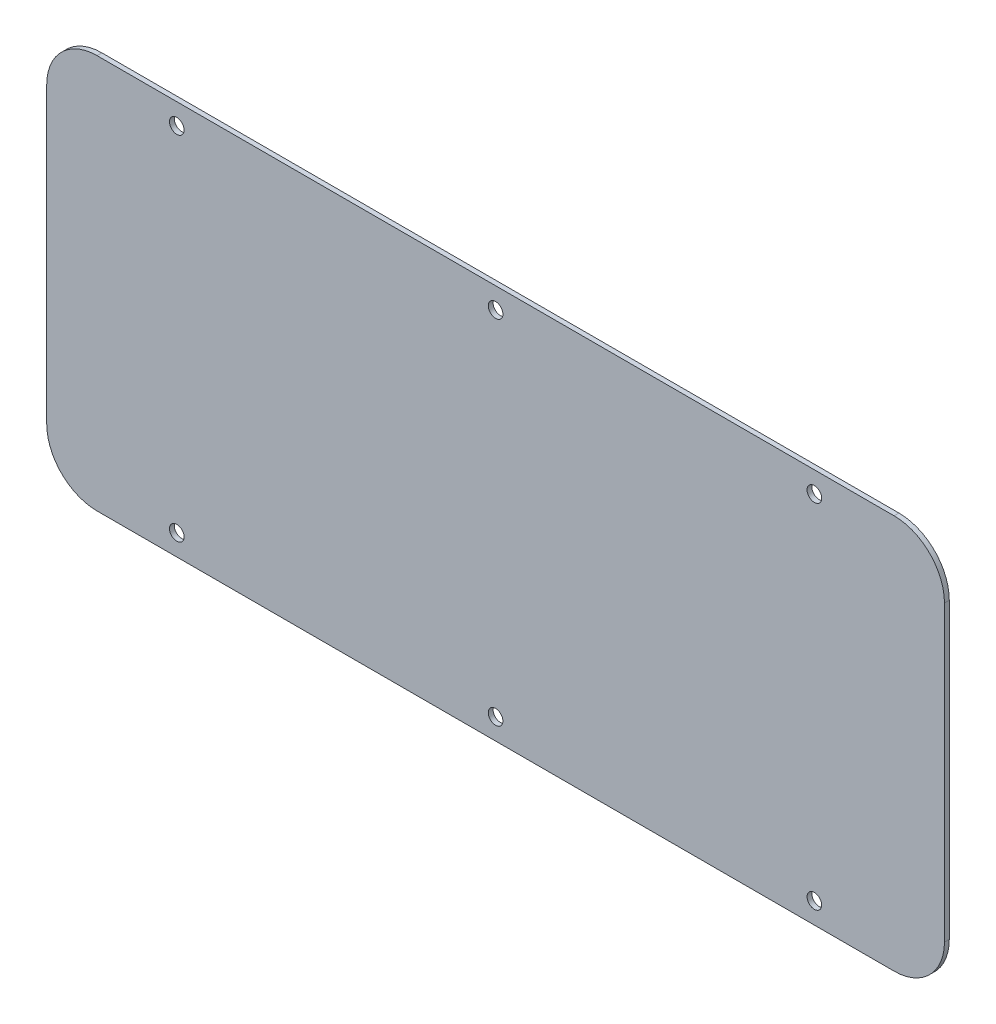
ISO-10303-21;
HEADER;
FILE_DESCRIPTION(('STEP AP214'),'2;1');
FILE_NAME('part.step','',(''),(''),'','','');
FILE_SCHEMA(('AUTOMOTIVE_DESIGN { 1 0 10303 214 1 1 1 1 }'));
ENDSEC;
DATA;
#1=APPLICATION_CONTEXT('core data for automotive mechanical design processes');
#2=APPLICATION_PROTOCOL_DEFINITION('international standard','automotive_design',2000,#1);
#3=PRODUCT_CONTEXT('',#1,'mechanical');
#4=PRODUCT('Part','Part','',(#3));
#5=PRODUCT_RELATED_PRODUCT_CATEGORY('part','',(#4));
#6=PRODUCT_DEFINITION_FORMATION('','',#4);
#7=PRODUCT_DEFINITION_CONTEXT('part definition',#1,'design');
#8=PRODUCT_DEFINITION('design','',#6,#7);
#9=PRODUCT_DEFINITION_SHAPE('','',#8);
#10=(LENGTH_UNIT() NAMED_UNIT(*) SI_UNIT(.MILLI.,.METRE.));
#11=(NAMED_UNIT(*) PLANE_ANGLE_UNIT() SI_UNIT($,.RADIAN.));
#12=(NAMED_UNIT(*) SI_UNIT($,.STERADIAN.) SOLID_ANGLE_UNIT());
#13=UNCERTAINTY_MEASURE_WITH_UNIT(LENGTH_MEASURE(1.E-05),#10,'distance_accuracy_value','');
#14=(GEOMETRIC_REPRESENTATION_CONTEXT(3) GLOBAL_UNCERTAINTY_ASSIGNED_CONTEXT((#13)) GLOBAL_UNIT_ASSIGNED_CONTEXT((#10,
#11,#12)) REPRESENTATION_CONTEXT('',''));
#15=CARTESIAN_POINT('',(0.,0.,0.));
#16=DIRECTION('',(0.,0.,1.));
#17=DIRECTION('',(1.,0.,0.));
#18=AXIS2_PLACEMENT_3D('',#15,#16,#17);
#19=CARTESIAN_POINT('',(-169.8625,-74.6125,0.));
#20=DIRECTION('',(0.,0.,1.));
#21=DIRECTION('',(1.,0.,0.));
#22=AXIS2_PLACEMENT_3D('',#19,#20,#21);
#23=PLANE('',#22);
#24=DIRECTION('',(1.,0.,0.));
#25=VECTOR('',#24,1.);
#26=CARTESIAN_POINT('',(169.8625,74.6125,0.));
#27=LINE('',#26,#25);
#28=CARTESIAN_POINT('',(-150.8125,74.6125,0.));
#29=VERTEX_POINT('',#28);
#30=CARTESIAN_POINT('',(150.8125,74.6125,0.));
#31=VERTEX_POINT('',#30);
#32=EDGE_CURVE('E115',#29,#31,#27,.T.);
#33=ORIENTED_EDGE('',*,*,#32,.F.);
#34=CARTESIAN_POINT('',(-150.8125,55.5625,0.));
#35=DIRECTION('',(0.,0.,-1.));
#36=DIRECTION('',(-1.,0.,0.));
#37=AXIS2_PLACEMENT_3D('',#34,#35,#36);
#38=CIRCLE('',#37,19.05);
#39=CARTESIAN_POINT('',(-169.8625,55.5625,0.));
#40=VERTEX_POINT('',#39);
#41=EDGE_CURVE('E151',#40,#29,#38,.T.);
#42=ORIENTED_EDGE('',*,*,#41,.F.);
#43=DIRECTION('',(0.,1.,0.));
#44=VECTOR('',#43,1.);
#45=CARTESIAN_POINT('',(-169.8625,74.6125,0.));
#46=LINE('',#45,#44);
#47=CARTESIAN_POINT('',(-169.8625,-55.5625,0.));
#48=VERTEX_POINT('',#47);
#49=EDGE_CURVE('E111',#48,#40,#46,.T.);
#50=ORIENTED_EDGE('',*,*,#49,.F.);
#51=CARTESIAN_POINT('',(-150.8125,-55.5625,0.));
#52=DIRECTION('',(0.,0.,-1.));
#53=DIRECTION('',(-1.,0.,0.));
#54=AXIS2_PLACEMENT_3D('',#51,#52,#53);
#55=CIRCLE('',#54,19.05);
#56=CARTESIAN_POINT('',(-150.8125,-74.6125,0.));
#57=VERTEX_POINT('',#56);
#58=EDGE_CURVE('E149',#57,#48,#55,.T.);
#59=ORIENTED_EDGE('',*,*,#58,.F.);
#60=DIRECTION('',(1.,0.,0.));
#61=VECTOR('',#60,1.);
#62=CARTESIAN_POINT('',(-169.8625,-74.6125,0.));
#63=LINE('',#62,#61);
#64=CARTESIAN_POINT('',(150.8125,-74.6125,0.));
#65=VERTEX_POINT('',#64);
#66=EDGE_CURVE('E94',#65,#57,#63,.F.);
#67=ORIENTED_EDGE('',*,*,#66,.F.);
#68=CARTESIAN_POINT('',(150.8125,-55.5625,0.));
#69=DIRECTION('',(0.,0.,-1.));
#70=DIRECTION('',(-1.,0.,0.));
#71=AXIS2_PLACEMENT_3D('',#68,#69,#70);
#72=CIRCLE('',#71,19.05);
#73=CARTESIAN_POINT('',(169.8625,-55.5625,0.));
#74=VERTEX_POINT('',#73);
#75=EDGE_CURVE('E87',#74,#65,#72,.T.);
#76=ORIENTED_EDGE('',*,*,#75,.F.);
#77=DIRECTION('',(0.,1.,0.));
#78=VECTOR('',#77,1.);
#79=CARTESIAN_POINT('',(169.8625,-74.6125,0.));
#80=LINE('',#79,#78);
#81=CARTESIAN_POINT('',(169.8625,55.5625,0.));
#82=VERTEX_POINT('',#81);
#83=EDGE_CURVE('E77',#82,#74,#80,.F.);
#84=ORIENTED_EDGE('',*,*,#83,.F.);
#85=CARTESIAN_POINT('',(150.8125,55.5625,0.));
#86=DIRECTION('',(0.,0.,-1.));
#87=DIRECTION('',(-1.,0.,0.));
#88=AXIS2_PLACEMENT_3D('',#85,#86,#87);
#89=CIRCLE('',#88,19.05);
#90=EDGE_CURVE('E103',#31,#82,#89,.T.);
#91=ORIENTED_EDGE('',*,*,#90,.F.);
#92=EDGE_LOOP('',(#33,#42,#50,#59,#67,#76,#84,#91));
#93=FACE_BOUND('',#92,.T.);
#94=CARTESIAN_POINT('',(-120.6373,-66.675,0.));
#95=DIRECTION('',(0.,0.,-1.));
#96=DIRECTION('',(-1.,0.,0.));
#97=AXIS2_PLACEMENT_3D('',#94,#95,#96);
#98=CIRCLE('',#97,2.7686);
#99=CARTESIAN_POINT('',(-123.4059,-66.675,0.));
#100=VERTEX_POINT('',#99);
#101=EDGE_CURVE('E98',#100,#100,#98,.T.);
#102=ORIENTED_EDGE('',*,*,#101,.T.);
#103=EDGE_LOOP('',(#102));
#104=FACE_BOUND('',#103,.T.);
#105=CARTESIAN_POINT('',(0.,-66.675,0.));
#106=DIRECTION('',(0.,0.,-1.));
#107=DIRECTION('',(-1.,0.,0.));
#108=AXIS2_PLACEMENT_3D('',#105,#106,#107);
#109=CIRCLE('',#108,2.7686);
#110=CARTESIAN_POINT('',(-2.76860000000004,-66.675,0.));
#111=VERTEX_POINT('',#110);
#112=EDGE_CURVE('E155',#111,#111,#109,.T.);
#113=ORIENTED_EDGE('',*,*,#112,.T.);
#114=EDGE_LOOP('',(#113));
#115=FACE_BOUND('',#114,.T.);
#116=CARTESIAN_POINT('',(120.6373,-66.675,0.));
#117=DIRECTION('',(0.,0.,-1.));
#118=DIRECTION('',(-1.,0.,0.));
#119=AXIS2_PLACEMENT_3D('',#116,#117,#118);
#120=CIRCLE('',#119,2.7686);
#121=CARTESIAN_POINT('',(117.8687,-66.675,0.));
#122=VERTEX_POINT('',#121);
#123=EDGE_CURVE('E158',#122,#122,#120,.T.);
#124=ORIENTED_EDGE('',*,*,#123,.T.);
#125=EDGE_LOOP('',(#124));
#126=FACE_BOUND('',#125,.T.);
#127=CARTESIAN_POINT('',(-120.6373,66.675,0.));
#128=DIRECTION('',(0.,0.,-1.));
#129=DIRECTION('',(-1.,0.,0.));
#130=AXIS2_PLACEMENT_3D('',#127,#128,#129);
#131=CIRCLE('',#130,2.7686);
#132=CARTESIAN_POINT('',(-123.4059,66.675,0.));
#133=VERTEX_POINT('',#132);
#134=EDGE_CURVE('E161',#133,#133,#131,.T.);
#135=ORIENTED_EDGE('',*,*,#134,.T.);
#136=EDGE_LOOP('',(#135));
#137=FACE_BOUND('',#136,.T.);
#138=CARTESIAN_POINT('',(0.,66.675,0.));
#139=DIRECTION('',(0.,0.,-1.));
#140=DIRECTION('',(-1.,0.,0.));
#141=AXIS2_PLACEMENT_3D('',#138,#139,#140);
#142=CIRCLE('',#141,2.7686);
#143=CARTESIAN_POINT('',(-2.76860000000004,66.675,0.));
#144=VERTEX_POINT('',#143);
#145=EDGE_CURVE('E163',#144,#144,#142,.T.);
#146=ORIENTED_EDGE('',*,*,#145,.T.);
#147=EDGE_LOOP('',(#146));
#148=FACE_BOUND('',#147,.T.);
#149=CARTESIAN_POINT('',(120.6373,66.675,0.));
#150=DIRECTION('',(0.,0.,-1.));
#151=DIRECTION('',(-1.,0.,0.));
#152=AXIS2_PLACEMENT_3D('',#149,#150,#151);
#153=CIRCLE('',#152,2.7686);
#154=CARTESIAN_POINT('',(117.8687,66.675,0.));
#155=VERTEX_POINT('',#154);
#156=EDGE_CURVE('E19',#155,#155,#153,.T.);
#157=ORIENTED_EDGE('',*,*,#156,.T.);
#158=EDGE_LOOP('',(#157));
#159=FACE_BOUND('',#158,.T.);
#160=ADVANCED_FACE('F16',(#93,#104,#115,#126,#137,#148,#159),#23,.T.);
#161=CARTESIAN_POINT('',(120.6373,66.675,-371.058648678938));
#162=DIRECTION('',(0.,0.,-1.));
#163=DIRECTION('',(-1.,0.,0.));
#164=AXIS2_PLACEMENT_3D('',#161,#162,#163);
#165=CYLINDRICAL_SURFACE('',#164,2.7686);
#166=ORIENTED_EDGE('',*,*,#156,.F.);
#167=EDGE_LOOP('',(#166));
#168=FACE_BOUND('',#167,.T.);
#169=CARTESIAN_POINT('',(120.6373,66.675,-1.82880000000002));
#170=DIRECTION('',(0.,0.,-1.));
#171=DIRECTION('',(-1.,0.,0.));
#172=AXIS2_PLACEMENT_3D('',#169,#170,#171);
#173=CIRCLE('',#172,2.7686);
#174=CARTESIAN_POINT('',(117.8687,66.675,-1.82880000000002));
#175=VERTEX_POINT('',#174);
#176=EDGE_CURVE('E145',#175,#175,#173,.T.);
#177=ORIENTED_EDGE('',*,*,#176,.T.);
#178=EDGE_LOOP('',(#177));
#179=FACE_BOUND('',#178,.T.);
#180=ADVANCED_FACE('F171',(#168,#179),#165,.F.);
#181=CARTESIAN_POINT('',(0.,66.675,-371.058648678938));
#182=DIRECTION('',(0.,0.,-1.));
#183=DIRECTION('',(-1.,0.,0.));
#184=AXIS2_PLACEMENT_3D('',#181,#182,#183);
#185=CYLINDRICAL_SURFACE('',#184,2.7686);
#186=ORIENTED_EDGE('',*,*,#145,.F.);
#187=EDGE_LOOP('',(#186));
#188=FACE_BOUND('',#187,.T.);
#189=CARTESIAN_POINT('',(0.,66.675,-1.82880000000002));
#190=DIRECTION('',(0.,0.,-1.));
#191=DIRECTION('',(-1.,0.,0.));
#192=AXIS2_PLACEMENT_3D('',#189,#190,#191);
#193=CIRCLE('',#192,2.7686);
#194=CARTESIAN_POINT('',(-2.76860000000004,66.675,-1.82880000000002));
#195=VERTEX_POINT('',#194);
#196=EDGE_CURVE('E142',#195,#195,#193,.T.);
#197=ORIENTED_EDGE('',*,*,#196,.T.);
#198=EDGE_LOOP('',(#197));
#199=FACE_BOUND('',#198,.T.);
#200=ADVANCED_FACE('F174',(#188,#199),#185,.F.);
#201=CARTESIAN_POINT('',(-120.6373,66.675,-371.058648678938));
#202=DIRECTION('',(0.,0.,-1.));
#203=DIRECTION('',(-1.,0.,0.));
#204=AXIS2_PLACEMENT_3D('',#201,#202,#203);
#205=CYLINDRICAL_SURFACE('',#204,2.7686);
#206=ORIENTED_EDGE('',*,*,#134,.F.);
#207=EDGE_LOOP('',(#206));
#208=FACE_BOUND('',#207,.T.);
#209=CARTESIAN_POINT('',(-120.6373,66.675,-1.82880000000002));
#210=DIRECTION('',(0.,0.,-1.));
#211=DIRECTION('',(-1.,0.,0.));
#212=AXIS2_PLACEMENT_3D('',#209,#210,#211);
#213=CIRCLE('',#212,2.7686);
#214=CARTESIAN_POINT('',(-123.4059,66.675,-1.82880000000002));
#215=VERTEX_POINT('',#214);
#216=EDGE_CURVE('E139',#215,#215,#213,.T.);
#217=ORIENTED_EDGE('',*,*,#216,.T.);
#218=EDGE_LOOP('',(#217));
#219=FACE_BOUND('',#218,.T.);
#220=ADVANCED_FACE('F225',(#208,#219),#205,.F.);
#221=CARTESIAN_POINT('',(120.6373,-66.675,-371.058648678938));
#222=DIRECTION('',(0.,0.,-1.));
#223=DIRECTION('',(-1.,0.,0.));
#224=AXIS2_PLACEMENT_3D('',#221,#222,#223);
#225=CYLINDRICAL_SURFACE('',#224,2.7686);
#226=ORIENTED_EDGE('',*,*,#123,.F.);
#227=EDGE_LOOP('',(#226));
#228=FACE_BOUND('',#227,.T.);
#229=CARTESIAN_POINT('',(120.6373,-66.675,-1.82880000000002));
#230=DIRECTION('',(0.,0.,-1.));
#231=DIRECTION('',(-1.,0.,0.));
#232=AXIS2_PLACEMENT_3D('',#229,#230,#231);
#233=CIRCLE('',#232,2.7686);
#234=CARTESIAN_POINT('',(117.8687,-66.675,-1.82880000000002));
#235=VERTEX_POINT('',#234);
#236=EDGE_CURVE('E136',#235,#235,#233,.T.);
#237=ORIENTED_EDGE('',*,*,#236,.T.);
#238=EDGE_LOOP('',(#237));
#239=FACE_BOUND('',#238,.T.);
#240=ADVANCED_FACE('F221',(#228,#239),#225,.F.);
#241=CARTESIAN_POINT('',(0.,-66.675,-371.058648678938));
#242=DIRECTION('',(0.,0.,-1.));
#243=DIRECTION('',(-1.,0.,0.));
#244=AXIS2_PLACEMENT_3D('',#241,#242,#243);
#245=CYLINDRICAL_SURFACE('',#244,2.7686);
#246=ORIENTED_EDGE('',*,*,#112,.F.);
#247=EDGE_LOOP('',(#246));
#248=FACE_BOUND('',#247,.T.);
#249=CARTESIAN_POINT('',(0.,-66.675,-1.82880000000002));
#250=DIRECTION('',(0.,0.,-1.));
#251=DIRECTION('',(-1.,0.,0.));
#252=AXIS2_PLACEMENT_3D('',#249,#250,#251);
#253=CIRCLE('',#252,2.7686);
#254=CARTESIAN_POINT('',(-2.76860000000004,-66.675,-1.82880000000002));
#255=VERTEX_POINT('',#254);
#256=EDGE_CURVE('E133',#255,#255,#253,.T.);
#257=ORIENTED_EDGE('',*,*,#256,.T.);
#258=EDGE_LOOP('',(#257));
#259=FACE_BOUND('',#258,.T.);
#260=ADVANCED_FACE('F217',(#248,#259),#245,.F.);
#261=CARTESIAN_POINT('',(-120.6373,-66.675,-371.058648678938));
#262=DIRECTION('',(0.,0.,-1.));
#263=DIRECTION('',(-1.,0.,0.));
#264=AXIS2_PLACEMENT_3D('',#261,#262,#263);
#265=CYLINDRICAL_SURFACE('',#264,2.7686);
#266=ORIENTED_EDGE('',*,*,#101,.F.);
#267=EDGE_LOOP('',(#266));
#268=FACE_BOUND('',#267,.T.);
#269=CARTESIAN_POINT('',(-120.6373,-66.675,-1.82880000000002));
#270=DIRECTION('',(0.,0.,-1.));
#271=DIRECTION('',(-1.,0.,0.));
#272=AXIS2_PLACEMENT_3D('',#269,#270,#271);
#273=CIRCLE('',#272,2.7686);
#274=CARTESIAN_POINT('',(-123.4059,-66.675,-1.82880000000002));
#275=VERTEX_POINT('',#274);
#276=EDGE_CURVE('E130',#275,#275,#273,.T.);
#277=ORIENTED_EDGE('',*,*,#276,.T.);
#278=EDGE_LOOP('',(#277));
#279=FACE_BOUND('',#278,.T.);
#280=ADVANCED_FACE('F214',(#268,#279),#265,.F.);
#281=CARTESIAN_POINT('',(150.8125,-55.5625,-1.8288));
#282=DIRECTION('',(0.,0.,-1.));
#283=DIRECTION('',(-1.,0.,0.));
#284=AXIS2_PLACEMENT_3D('',#281,#282,#283);
#285=CYLINDRICAL_SURFACE('',#284,19.05);
#286=ORIENTED_EDGE('',*,*,#75,.T.);
#287=DIRECTION('',(0.,0.,-1.));
#288=VECTOR('',#287,1.);
#289=CARTESIAN_POINT('',(150.8125,-74.6125,-1.8288));
#290=LINE('',#289,#288);
#291=CARTESIAN_POINT('',(150.8125,-74.6125,-1.8288));
#292=VERTEX_POINT('',#291);
#293=EDGE_CURVE('E148',#292,#65,#290,.F.);
#294=ORIENTED_EDGE('',*,*,#293,.F.);
#295=CARTESIAN_POINT('',(150.8125,-55.5625,-1.8288));
#296=DIRECTION('',(0.,0.,-1.));
#297=DIRECTION('',(-1.,0.,0.));
#298=AXIS2_PLACEMENT_3D('',#295,#296,#297);
#299=CIRCLE('',#298,19.05);
#300=CARTESIAN_POINT('',(169.8625,-55.5625,-1.8288));
#301=VERTEX_POINT('',#300);
#302=EDGE_CURVE('E102',#292,#301,#299,.F.);
#303=ORIENTED_EDGE('',*,*,#302,.T.);
#304=DIRECTION('',(0.,0.,1.));
#305=VECTOR('',#304,1.);
#306=CARTESIAN_POINT('',(169.8625,-55.5625,-1.8288));
#307=LINE('',#306,#305);
#308=EDGE_CURVE('E82',#74,#301,#307,.F.);
#309=ORIENTED_EDGE('',*,*,#308,.F.);
#310=EDGE_LOOP('',(#286,#294,#303,#309));
#311=FACE_BOUND('',#310,.T.);
#312=ADVANCED_FACE('F101',(#311),#285,.T.);
#313=CARTESIAN_POINT('',(169.8625,-74.6125,-1.8288));
#314=DIRECTION('',(1.,0.,0.));
#315=DIRECTION('',(0.,1.,0.));
#316=AXIS2_PLACEMENT_3D('',#313,#314,#315);
#317=PLANE('',#316);
#318=ORIENTED_EDGE('',*,*,#83,.T.);
#319=ORIENTED_EDGE('',*,*,#308,.T.);
#320=DIRECTION('',(0.,1.,0.));
#321=VECTOR('',#320,1.);
#322=CARTESIAN_POINT('',(169.8625,-74.6125,-1.8288));
#323=LINE('',#322,#321);
#324=CARTESIAN_POINT('',(169.8625,55.5625,-1.8288));
#325=VERTEX_POINT('',#324);
#326=EDGE_CURVE('E128',#301,#325,#323,.T.);
#327=ORIENTED_EDGE('',*,*,#326,.T.);
#328=DIRECTION('',(0.,0.,-1.));
#329=VECTOR('',#328,1.);
#330=CARTESIAN_POINT('',(169.8625,55.5625,-1.8288));
#331=LINE('',#330,#329);
#332=EDGE_CURVE('E84',#82,#325,#331,.T.);
#333=ORIENTED_EDGE('',*,*,#332,.F.);
#334=EDGE_LOOP('',(#318,#319,#327,#333));
#335=FACE_BOUND('',#334,.T.);
#336=ADVANCED_FACE('F79',(#335),#317,.T.);
#337=CARTESIAN_POINT('',(150.8125,55.5625,-1.8288));
#338=DIRECTION('',(0.,0.,-1.));
#339=DIRECTION('',(-1.,0.,0.));
#340=AXIS2_PLACEMENT_3D('',#337,#338,#339);
#341=CYLINDRICAL_SURFACE('',#340,19.05);
#342=ORIENTED_EDGE('',*,*,#90,.T.);
#343=ORIENTED_EDGE('',*,*,#332,.T.);
#344=CARTESIAN_POINT('',(150.8125,55.5625,-1.8288));
#345=DIRECTION('',(0.,0.,-1.));
#346=DIRECTION('',(-1.,0.,0.));
#347=AXIS2_PLACEMENT_3D('',#344,#345,#346);
#348=CIRCLE('',#347,19.05);
#349=CARTESIAN_POINT('',(150.8125,74.6125,-1.8288));
#350=VERTEX_POINT('',#349);
#351=EDGE_CURVE('E125',#325,#350,#348,.F.);
#352=ORIENTED_EDGE('',*,*,#351,.T.);
#353=DIRECTION('',(0.,0.,1.));
#354=VECTOR('',#353,1.);
#355=CARTESIAN_POINT('',(150.8125,74.6125,-1.8288));
#356=LINE('',#355,#354);
#357=EDGE_CURVE('E116',#31,#350,#356,.F.);
#358=ORIENTED_EDGE('',*,*,#357,.F.);
#359=EDGE_LOOP('',(#342,#343,#352,#358));
#360=FACE_BOUND('',#359,.T.);
#361=ADVANCED_FACE('F205',(#360),#341,.T.);
#362=CARTESIAN_POINT('',(169.8625,74.6125,-1.8288));
#363=DIRECTION('',(0.,1.,0.));
#364=DIRECTION('',(0.,0.,1.));
#365=AXIS2_PLACEMENT_3D('',#362,#363,#364);
#366=PLANE('',#365);
#367=ORIENTED_EDGE('',*,*,#32,.T.);
#368=ORIENTED_EDGE('',*,*,#357,.T.);
#369=DIRECTION('',(1.,0.,0.));
#370=VECTOR('',#369,1.);
#371=CARTESIAN_POINT('',(-169.8625,74.6125,-1.8288));
#372=LINE('',#371,#370);
#373=CARTESIAN_POINT('',(-150.8125,74.6125,-1.8288));
#374=VERTEX_POINT('',#373);
#375=EDGE_CURVE('E124',#350,#374,#372,.F.);
#376=ORIENTED_EDGE('',*,*,#375,.T.);
#377=DIRECTION('',(0.,0.,-1.));
#378=VECTOR('',#377,1.);
#379=CARTESIAN_POINT('',(-150.8125,74.6125,-1.8288));
#380=LINE('',#379,#378);
#381=EDGE_CURVE('E114',#29,#374,#380,.T.);
#382=ORIENTED_EDGE('',*,*,#381,.F.);
#383=EDGE_LOOP('',(#367,#368,#376,#382));
#384=FACE_BOUND('',#383,.T.);
#385=ADVANCED_FACE('F201',(#384),#366,.T.);
#386=CARTESIAN_POINT('',(-150.8125,55.5625,-1.8288));
#387=DIRECTION('',(0.,0.,-1.));
#388=DIRECTION('',(-1.,0.,0.));
#389=AXIS2_PLACEMENT_3D('',#386,#387,#388);
#390=CYLINDRICAL_SURFACE('',#389,19.05);
#391=ORIENTED_EDGE('',*,*,#41,.T.);
#392=ORIENTED_EDGE('',*,*,#381,.T.);
#393=CARTESIAN_POINT('',(-150.8125,55.5625,-1.8288));
#394=DIRECTION('',(0.,0.,-1.));
#395=DIRECTION('',(-1.,0.,0.));
#396=AXIS2_PLACEMENT_3D('',#393,#394,#395);
#397=CIRCLE('',#396,19.05);
#398=CARTESIAN_POINT('',(-169.8625,55.5625,-1.8288));
#399=VERTEX_POINT('',#398);
#400=EDGE_CURVE('E121',#374,#399,#397,.F.);
#401=ORIENTED_EDGE('',*,*,#400,.T.);
#402=DIRECTION('',(0.,0.,1.));
#403=VECTOR('',#402,1.);
#404=CARTESIAN_POINT('',(-169.8625,55.5625,-1.8288));
#405=LINE('',#404,#403);
#406=EDGE_CURVE('E113',#40,#399,#405,.F.);
#407=ORIENTED_EDGE('',*,*,#406,.F.);
#408=EDGE_LOOP('',(#391,#392,#401,#407));
#409=FACE_BOUND('',#408,.T.);
#410=ADVANCED_FACE('F197',(#409),#390,.T.);
#411=CARTESIAN_POINT('',(-169.8625,74.6125,-1.8288));
#412=DIRECTION('',(-1.,0.,0.));
#413=DIRECTION('',(0.,0.,1.));
#414=AXIS2_PLACEMENT_3D('',#411,#412,#413);
#415=PLANE('',#414);
#416=ORIENTED_EDGE('',*,*,#49,.T.);
#417=ORIENTED_EDGE('',*,*,#406,.T.);
#418=DIRECTION('',(0.,1.,0.));
#419=VECTOR('',#418,1.);
#420=CARTESIAN_POINT('',(-169.8625,-74.6125,-1.8288));
#421=LINE('',#420,#419);
#422=CARTESIAN_POINT('',(-169.8625,-55.5625,-1.8288));
#423=VERTEX_POINT('',#422);
#424=EDGE_CURVE('E120',#399,#423,#421,.F.);
#425=ORIENTED_EDGE('',*,*,#424,.T.);
#426=DIRECTION('',(0.,0.,-1.));
#427=VECTOR('',#426,1.);
#428=CARTESIAN_POINT('',(-169.8625,-55.5625,-1.8288));
#429=LINE('',#428,#427);
#430=EDGE_CURVE('E110',#48,#423,#429,.T.);
#431=ORIENTED_EDGE('',*,*,#430,.F.);
#432=EDGE_LOOP('',(#416,#417,#425,#431));
#433=FACE_BOUND('',#432,.T.);
#434=ADVANCED_FACE('F193',(#433),#415,.T.);
#435=CARTESIAN_POINT('',(-150.8125,-55.5625,-1.8288));
#436=DIRECTION('',(0.,0.,-1.));
#437=DIRECTION('',(-1.,0.,0.));
#438=AXIS2_PLACEMENT_3D('',#435,#436,#437);
#439=CYLINDRICAL_SURFACE('',#438,19.05);
#440=ORIENTED_EDGE('',*,*,#58,.T.);
#441=ORIENTED_EDGE('',*,*,#430,.T.);
#442=CARTESIAN_POINT('',(-150.8125,-55.5625,-1.8288));
#443=DIRECTION('',(0.,0.,-1.));
#444=DIRECTION('',(-1.,0.,0.));
#445=AXIS2_PLACEMENT_3D('',#442,#443,#444);
#446=CIRCLE('',#445,19.05);
#447=CARTESIAN_POINT('',(-150.8125,-74.6125,-1.8288));
#448=VERTEX_POINT('',#447);
#449=EDGE_CURVE('E25',#423,#448,#446,.F.);
#450=ORIENTED_EDGE('',*,*,#449,.T.);
#451=DIRECTION('',(0.,0.,-1.));
#452=VECTOR('',#451,1.);
#453=CARTESIAN_POINT('',(-150.8125,-74.6125,-1.8288));
#454=LINE('',#453,#452);
#455=EDGE_CURVE('E33',#57,#448,#454,.T.);
#456=ORIENTED_EDGE('',*,*,#455,.F.);
#457=EDGE_LOOP('',(#440,#441,#450,#456));
#458=FACE_BOUND('',#457,.T.);
#459=ADVANCED_FACE('F186',(#458),#439,.T.);
#460=CARTESIAN_POINT('',(-169.8625,-74.6125,-1.8288));
#461=DIRECTION('',(0.,-1.,0.));
#462=DIRECTION('',(0.,0.,-1.));
#463=AXIS2_PLACEMENT_3D('',#460,#461,#462);
#464=PLANE('',#463);
#465=DIRECTION('',(1.,0.,0.));
#466=VECTOR('',#465,1.);
#467=CARTESIAN_POINT('',(-169.8625,-74.6125,-1.8288));
#468=LINE('',#467,#466);
#469=EDGE_CURVE('E11',#448,#292,#468,.T.);
#470=ORIENTED_EDGE('',*,*,#469,.T.);
#471=ORIENTED_EDGE('',*,*,#293,.T.);
#472=ORIENTED_EDGE('',*,*,#66,.T.);
#473=ORIENTED_EDGE('',*,*,#455,.T.);
#474=EDGE_LOOP('',(#470,#471,#472,#473));
#475=FACE_BOUND('',#474,.T.);
#476=ADVANCED_FACE('F179',(#475),#464,.T.);
#477=CARTESIAN_POINT('',(-169.8625,-74.6125,-1.8288));
#478=DIRECTION('',(0.,0.,1.));
#479=DIRECTION('',(1.,0.,0.));
#480=AXIS2_PLACEMENT_3D('',#477,#478,#479);
#481=PLANE('',#480);
#482=ORIENTED_EDGE('',*,*,#449,.F.);
#483=ORIENTED_EDGE('',*,*,#424,.F.);
#484=ORIENTED_EDGE('',*,*,#400,.F.);
#485=ORIENTED_EDGE('',*,*,#375,.F.);
#486=ORIENTED_EDGE('',*,*,#351,.F.);
#487=ORIENTED_EDGE('',*,*,#326,.F.);
#488=ORIENTED_EDGE('',*,*,#302,.F.);
#489=ORIENTED_EDGE('',*,*,#469,.F.);
#490=EDGE_LOOP('',(#482,#483,#484,#485,#486,#487,#488,#489));
#491=FACE_BOUND('',#490,.T.);
#492=ORIENTED_EDGE('',*,*,#276,.F.);
#493=EDGE_LOOP('',(#492));
#494=FACE_BOUND('',#493,.T.);
#495=ORIENTED_EDGE('',*,*,#256,.F.);
#496=EDGE_LOOP('',(#495));
#497=FACE_BOUND('',#496,.T.);
#498=ORIENTED_EDGE('',*,*,#236,.F.);
#499=EDGE_LOOP('',(#498));
#500=FACE_BOUND('',#499,.T.);
#501=ORIENTED_EDGE('',*,*,#216,.F.);
#502=EDGE_LOOP('',(#501));
#503=FACE_BOUND('',#502,.T.);
#504=ORIENTED_EDGE('',*,*,#196,.F.);
#505=EDGE_LOOP('',(#504));
#506=FACE_BOUND('',#505,.T.);
#507=ORIENTED_EDGE('',*,*,#176,.F.);
#508=EDGE_LOOP('',(#507));
#509=FACE_BOUND('',#508,.T.);
#510=ADVANCED_FACE('F177',(#491,#494,#497,#500,#503,#506,#509),#481,.F.);
#511=CLOSED_SHELL('',(#160,#180,#200,#220,#240,#260,#280,#312,#336,#361,#385,#410,#434,#459,
#476,#510));
#512=MANIFOLD_SOLID_BREP('B1',#511);
#513=ADVANCED_BREP_SHAPE_REPRESENTATION('',(#18,#512),#14);
#514=SHAPE_DEFINITION_REPRESENTATION(#9,#513);
ENDSEC;
END-ISO-10303-21;
